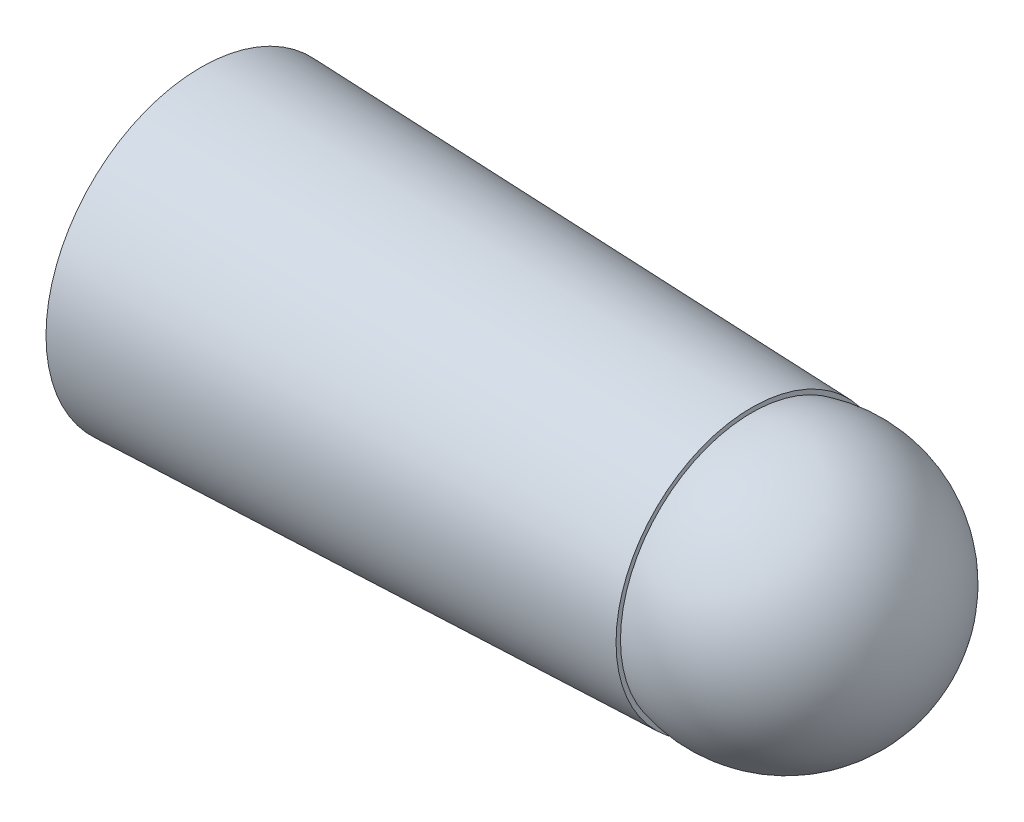
ISO-10303-21;
HEADER;
FILE_DESCRIPTION(('STEP AP214'),'2;1');
FILE_NAME('part.step','',(''),(''),'','','');
FILE_SCHEMA(('AUTOMOTIVE_DESIGN { 1 0 10303 214 1 1 1 1 }'));
ENDSEC;
DATA;
#1=APPLICATION_CONTEXT('core data for automotive mechanical design processes');
#2=APPLICATION_PROTOCOL_DEFINITION('international standard','automotive_design',2000,#1);
#3=PRODUCT_CONTEXT('',#1,'mechanical');
#4=PRODUCT('Part','Part','',(#3));
#5=PRODUCT_RELATED_PRODUCT_CATEGORY('part','',(#4));
#6=PRODUCT_DEFINITION_FORMATION('','',#4);
#7=PRODUCT_DEFINITION_CONTEXT('part definition',#1,'design');
#8=PRODUCT_DEFINITION('design','',#6,#7);
#9=PRODUCT_DEFINITION_SHAPE('','',#8);
#10=(LENGTH_UNIT() NAMED_UNIT(*) SI_UNIT(.MILLI.,.METRE.));
#11=(NAMED_UNIT(*) PLANE_ANGLE_UNIT() SI_UNIT($,.RADIAN.));
#12=(NAMED_UNIT(*) SI_UNIT($,.STERADIAN.) SOLID_ANGLE_UNIT());
#13=UNCERTAINTY_MEASURE_WITH_UNIT(LENGTH_MEASURE(1.E-05),#10,'distance_accuracy_value','');
#14=(GEOMETRIC_REPRESENTATION_CONTEXT(3) GLOBAL_UNCERTAINTY_ASSIGNED_CONTEXT((#13)) GLOBAL_UNIT_ASSIGNED_CONTEXT((#10,
#11,#12)) REPRESENTATION_CONTEXT('',''));
#15=CARTESIAN_POINT('',(0.,0.,0.));
#16=DIRECTION('',(0.,0.,1.));
#17=DIRECTION('',(1.,0.,0.));
#18=AXIS2_PLACEMENT_3D('',#15,#16,#17);
#19=CARTESIAN_POINT('',(8.,0.,0.));
#20=DIRECTION('',(1.,0.,0.));
#21=DIRECTION('',(0.,0.,1.));
#22=AXIS2_PLACEMENT_3D('',#19,#20,#21);
#23=PLANE('',#22);
#24=CARTESIAN_POINT('',(8.,0.,0.));
#25=DIRECTION('',(-1.,0.,0.));
#26=DIRECTION('',(0.,0.,1.));
#27=AXIS2_PLACEMENT_3D('',#24,#25,#26);
#28=CIRCLE('',#27,1.97063384406602);
#29=CARTESIAN_POINT('',(8.,0.,1.97063384406602));
#30=VERTEX_POINT('',#29);
#31=EDGE_CURVE('E10',#30,#30,#28,.T.);
#32=ORIENTED_EDGE('',*,*,#31,.F.);
#33=EDGE_LOOP('',(#32));
#34=FACE_BOUND('',#33,.T.);
#35=CARTESIAN_POINT('',(8.,0.,0.));
#36=DIRECTION('',(-1.,0.,0.));
#37=DIRECTION('',(0.,0.,1.));
#38=AXIS2_PLACEMENT_3D('',#35,#36,#37);
#39=CIRCLE('',#38,1.90614735720469);
#40=CARTESIAN_POINT('',(8.,0.,1.90614735720469));
#41=VERTEX_POINT('',#40);
#42=EDGE_CURVE('E39',#41,#41,#39,.F.);
#43=ORIENTED_EDGE('',*,*,#42,.F.);
#44=EDGE_LOOP('',(#43));
#45=FACE_BOUND('',#44,.T.);
#46=ADVANCED_FACE('F35',(#34,#45),#23,.T.);
#47=CARTESIAN_POINT('',(0.,0.,0.));
#48=DIRECTION('',(-1.,0.,0.));
#49=DIRECTION('',(0.,0.,1.));
#50=AXIS2_PLACEMENT_3D('',#47,#48,#49);
#51=CONICAL_SURFACE('',#50,2.25,0.0349065850398866);
#52=ORIENTED_EDGE('',*,*,#31,.T.);
#53=EDGE_LOOP('',(#52));
#54=FACE_BOUND('',#53,.T.);
#55=CARTESIAN_POINT('',(0.,0.,0.));
#56=DIRECTION('',(-1.,0.,0.));
#57=DIRECTION('',(0.,0.,1.));
#58=AXIS2_PLACEMENT_3D('',#55,#56,#57);
#59=CIRCLE('',#58,2.25);
#60=CARTESIAN_POINT('',(0.,0.,2.25));
#61=VERTEX_POINT('',#60);
#62=EDGE_CURVE('E43',#61,#61,#59,.T.);
#63=ORIENTED_EDGE('',*,*,#62,.F.);
#64=EDGE_LOOP('',(#63));
#65=FACE_BOUND('',#64,.T.);
#66=ADVANCED_FACE('F37',(#54,#65),#51,.T.);
#67=CARTESIAN_POINT('',(0.,0.,0.));
#68=DIRECTION('',(1.,0.,0.));
#69=DIRECTION('',(0.,0.,1.));
#70=AXIS2_PLACEMENT_3D('',#67,#68,#69);
#71=PLANE('',#70);
#72=ORIENTED_EDGE('',*,*,#62,.T.);
#73=EDGE_LOOP('',(#72));
#74=FACE_BOUND('',#73,.T.);
#75=ADVANCED_FACE('F61',(#74),#71,.F.);
#76=CARTESIAN_POINT('',(8.5,0.,0.));
#77=DIRECTION('',(0.,1.,0.));
#78=DIRECTION('',(0.,0.,1.));
#79=AXIS2_PLACEMENT_3D('',#76,#77,#78);
#80=SPHERICAL_SURFACE('',#79,1.97063384406602);
#81=CARTESIAN_POINT('',(8.5,0.,0.));
#82=DIRECTION('',(-1.,0.,0.));
#83=DIRECTION('',(0.,0.,1.));
#84=AXIS2_PLACEMENT_3D('',#81,#82,#83);
#85=SPHERICAL_SURFACE('',#84,1.97063384406602);
#86=ORIENTED_EDGE('',*,*,#42,.T.);
#87=EDGE_LOOP('',(#86));
#88=FACE_BOUND('',#87,.T.);
#89=ADVANCED_FACE('F53',(#88),#85,.T.);
#90=CLOSED_SHELL('',(#46,#66,#75,#89));
#91=MANIFOLD_SOLID_BREP('B2',#90);
#92=ADVANCED_BREP_SHAPE_REPRESENTATION('',(#18,#91),#14);
#93=SHAPE_DEFINITION_REPRESENTATION(#9,#92);
ENDSEC;
END-ISO-10303-21;
